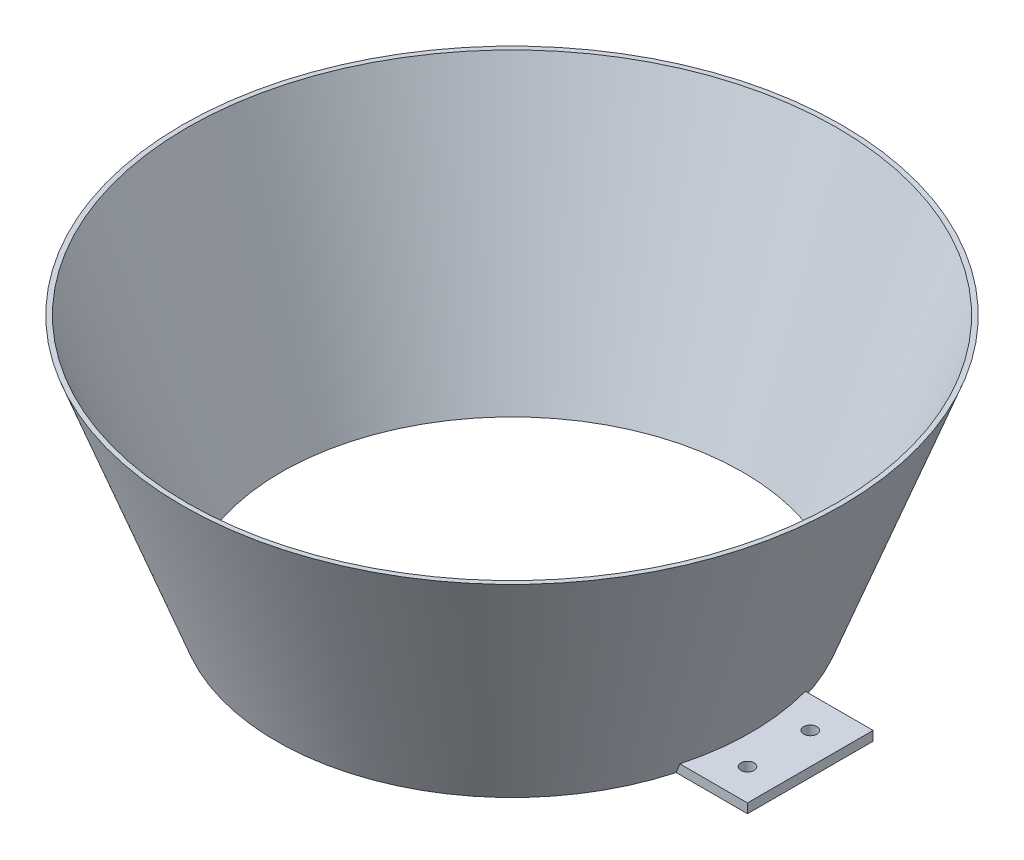
ISO-10303-21;
HEADER;
FILE_DESCRIPTION(('STEP AP214'),'2;1');
FILE_NAME('part.step','',(''),(''),'','','');
FILE_SCHEMA(('AUTOMOTIVE_DESIGN { 1 0 10303 214 1 1 1 1 }'));
ENDSEC;
DATA;
#1=APPLICATION_CONTEXT('core data for automotive mechanical design processes');
#2=APPLICATION_PROTOCOL_DEFINITION('international standard','automotive_design',2000,#1);
#3=PRODUCT_CONTEXT('',#1,'mechanical');
#4=PRODUCT('Part','Part','',(#3));
#5=PRODUCT_RELATED_PRODUCT_CATEGORY('part','',(#4));
#6=PRODUCT_DEFINITION_FORMATION('','',#4);
#7=PRODUCT_DEFINITION_CONTEXT('part definition',#1,'design');
#8=PRODUCT_DEFINITION('design','',#6,#7);
#9=PRODUCT_DEFINITION_SHAPE('','',#8);
#10=(LENGTH_UNIT() NAMED_UNIT(*) SI_UNIT(.MILLI.,.METRE.));
#11=(NAMED_UNIT(*) PLANE_ANGLE_UNIT() SI_UNIT($,.RADIAN.));
#12=(NAMED_UNIT(*) SI_UNIT($,.STERADIAN.) SOLID_ANGLE_UNIT());
#13=UNCERTAINTY_MEASURE_WITH_UNIT(LENGTH_MEASURE(1.E-05),#10,'distance_accuracy_value','');
#14=(GEOMETRIC_REPRESENTATION_CONTEXT(3) GLOBAL_UNCERTAINTY_ASSIGNED_CONTEXT((#13)) GLOBAL_UNIT_ASSIGNED_CONTEXT((#10,
#11,#12)) REPRESENTATION_CONTEXT('',''));
#15=CARTESIAN_POINT('',(0.,0.,0.));
#16=DIRECTION('',(0.,0.,1.));
#17=DIRECTION('',(1.,0.,0.));
#18=AXIS2_PLACEMENT_3D('',#15,#16,#17);
#19=CARTESIAN_POINT('',(0.,80.,0.));
#20=DIRECTION('',(0.,1.,0.));
#21=DIRECTION('',(0.,0.,1.));
#22=AXIS2_PLACEMENT_3D('',#19,#20,#21);
#23=CONICAL_SURFACE('',#22,103.5,0.358770670270572);
#24=CARTESIAN_POINT('',(0.,0.,0.));
#25=DIRECTION('',(0.,-1.,0.));
#26=DIRECTION('',(0.,0.,-1.));
#27=AXIS2_PLACEMENT_3D('',#24,#25,#26);
#28=CIRCLE('',#27,73.5);
#29=CARTESIAN_POINT('',(0.,0.,-73.5));
#30=VERTEX_POINT('',#29);
#31=EDGE_CURVE('E191',#30,#30,#28,.T.);
#32=ORIENTED_EDGE('',*,*,#31,.T.);
#33=EDGE_LOOP('',(#32));
#34=FACE_BOUND('',#33,.T.);
#35=CARTESIAN_POINT('',(0.,80.,0.));
#36=DIRECTION('',(0.,-1.,0.));
#37=DIRECTION('',(0.,0.,-1.));
#38=AXIS2_PLACEMENT_3D('',#35,#36,#37);
#39=CIRCLE('',#38,103.5);
#40=CARTESIAN_POINT('',(0.,80.,-103.5));
#41=VERTEX_POINT('',#40);
#42=EDGE_CURVE('E177',#41,#41,#39,.T.);
#43=ORIENTED_EDGE('',*,*,#42,.F.);
#44=EDGE_LOOP('',(#43));
#45=FACE_BOUND('',#44,.T.);
#46=ADVANCED_FACE('F45',(#34,#45),#23,.F.);
#47=CARTESIAN_POINT('',(73.5,0.,0.));
#48=DIRECTION('',(0.,-1.,0.));
#49=DIRECTION('',(0.,0.,-1.));
#50=AXIS2_PLACEMENT_3D('',#47,#48,#49);
#51=PLANE('',#50);
#52=CARTESIAN_POINT('',(-85.,0.,10.));
#53=DIRECTION('',(0.,-1.,0.));
#54=DIRECTION('',(0.,0.,1.));
#55=AXIS2_PLACEMENT_3D('',#52,#53,#54);
#56=CIRCLE('',#55,2.1);
#57=CARTESIAN_POINT('',(-85.,0.,12.1));
#58=VERTEX_POINT('',#57);
#59=EDGE_CURVE('E250',#58,#58,#56,.T.);
#60=ORIENTED_EDGE('',*,*,#59,.F.);
#61=EDGE_LOOP('',(#60));
#62=FACE_BOUND('',#61,.T.);
#63=CARTESIAN_POINT('',(-85.,0.,-10.));
#64=DIRECTION('',(0.,-1.,0.));
#65=DIRECTION('',(0.,0.,-1.));
#66=AXIS2_PLACEMENT_3D('',#63,#64,#65);
#67=CIRCLE('',#66,2.1);
#68=CARTESIAN_POINT('',(-85.,0.,-12.1));
#69=VERTEX_POINT('',#68);
#70=EDGE_CURVE('E254',#69,#69,#67,.T.);
#71=ORIENTED_EDGE('',*,*,#70,.F.);
#72=EDGE_LOOP('',(#71));
#73=FACE_BOUND('',#72,.T.);
#74=CARTESIAN_POINT('',(85.,0.,-10.));
#75=DIRECTION('',(0.,-1.,0.));
#76=DIRECTION('',(0.,0.,1.));
#77=AXIS2_PLACEMENT_3D('',#74,#75,#76);
#78=CIRCLE('',#77,2.1);
#79=CARTESIAN_POINT('',(85.,0.,-7.9));
#80=VERTEX_POINT('',#79);
#81=EDGE_CURVE('E258',#80,#80,#78,.T.);
#82=ORIENTED_EDGE('',*,*,#81,.F.);
#83=EDGE_LOOP('',(#82));
#84=FACE_BOUND('',#83,.T.);
#85=CARTESIAN_POINT('',(85.,0.,10.));
#86=DIRECTION('',(0.,-1.,0.));
#87=DIRECTION('',(0.,0.,-1.));
#88=AXIS2_PLACEMENT_3D('',#85,#86,#87);
#89=CIRCLE('',#88,2.1);
#90=CARTESIAN_POINT('',(85.,0.,7.9));
#91=VERTEX_POINT('',#90);
#92=EDGE_CURVE('E261',#91,#91,#89,.T.);
#93=ORIENTED_EDGE('',*,*,#92,.F.);
#94=EDGE_LOOP('',(#93));
#95=FACE_BOUND('',#94,.T.);
#96=CARTESIAN_POINT('',(0.,0.,0.));
#97=DIRECTION('',(0.,-1.,0.));
#98=DIRECTION('',(0.,0.,-1.));
#99=AXIS2_PLACEMENT_3D('',#96,#97,#98);
#100=CIRCLE('',#99,75.);
#101=CARTESIAN_POINT('',(72.2841614740048,0.,20.));
#102=VERTEX_POINT('',#101);
#103=CARTESIAN_POINT('',(-72.2841614740048,0.,20.));
#104=VERTEX_POINT('',#103);
#105=EDGE_CURVE('E188',#102,#104,#100,.T.);
#106=ORIENTED_EDGE('',*,*,#105,.T.);
#107=DIRECTION('',(-1.,0.,0.));
#108=VECTOR('',#107,1.);
#109=CARTESIAN_POINT('',(-95.,0.,20.));
#110=LINE('',#109,#108);
#111=CARTESIAN_POINT('',(-95.,0.,20.));
#112=VERTEX_POINT('',#111);
#113=EDGE_CURVE('E133',#104,#112,#110,.T.);
#114=ORIENTED_EDGE('',*,*,#113,.T.);
#115=DIRECTION('',(0.,0.,-1.));
#116=VECTOR('',#115,1.);
#117=CARTESIAN_POINT('',(-95.,0.,-20.));
#118=LINE('',#117,#116);
#119=CARTESIAN_POINT('',(-95.,0.,-20.));
#120=VERTEX_POINT('',#119);
#121=EDGE_CURVE('E120',#112,#120,#118,.T.);
#122=ORIENTED_EDGE('',*,*,#121,.T.);
#123=DIRECTION('',(1.,0.,0.));
#124=VECTOR('',#123,1.);
#125=CARTESIAN_POINT('',(-72.2841614740048,0.,-20.));
#126=LINE('',#125,#124);
#127=CARTESIAN_POINT('',(-72.2841614740048,0.,-20.));
#128=VERTEX_POINT('',#127);
#129=EDGE_CURVE('E66',#120,#128,#126,.T.);
#130=ORIENTED_EDGE('',*,*,#129,.T.);
#131=CARTESIAN_POINT('',(72.2841614740048,0.,-20.));
#132=VERTEX_POINT('',#131);
#133=EDGE_CURVE('E187',#128,#132,#100,.T.);
#134=ORIENTED_EDGE('',*,*,#133,.T.);
#135=DIRECTION('',(1.,0.,0.));
#136=VECTOR('',#135,1.);
#137=CARTESIAN_POINT('',(72.2841614740048,0.,-20.));
#138=LINE('',#137,#136);
#139=CARTESIAN_POINT('',(95.,0.,-20.));
#140=VERTEX_POINT('',#139);
#141=EDGE_CURVE('E148',#132,#140,#138,.T.);
#142=ORIENTED_EDGE('',*,*,#141,.T.);
#143=DIRECTION('',(0.,0.,1.));
#144=VECTOR('',#143,1.);
#145=CARTESIAN_POINT('',(95.,0.,-20.));
#146=LINE('',#145,#144);
#147=CARTESIAN_POINT('',(95.,0.,20.));
#148=VERTEX_POINT('',#147);
#149=EDGE_CURVE('E169',#140,#148,#146,.T.);
#150=ORIENTED_EDGE('',*,*,#149,.T.);
#151=DIRECTION('',(-1.,0.,0.));
#152=VECTOR('',#151,1.);
#153=CARTESIAN_POINT('',(95.,0.,20.));
#154=LINE('',#153,#152);
#155=EDGE_CURVE('E72',#148,#102,#154,.T.);
#156=ORIENTED_EDGE('',*,*,#155,.T.);
#157=EDGE_LOOP('',(#106,#114,#122,#130,#134,#142,#150,#156));
#158=FACE_BOUND('',#157,.T.);
#159=ORIENTED_EDGE('',*,*,#31,.F.);
#160=EDGE_LOOP('',(#159));
#161=FACE_BOUND('',#160,.T.);
#162=ADVANCED_FACE('F131',(#62,#73,#84,#95,#158,#161),#51,.T.);
#163=CARTESIAN_POINT('',(0.,0.,0.));
#164=DIRECTION('',(0.,1.,0.));
#165=DIRECTION('',(0.,0.,1.));
#166=AXIS2_PLACEMENT_3D('',#163,#164,#165);
#167=CONICAL_SURFACE('',#166,75.,0.358770670270572);
#168=CARTESIAN_POINT('',(-82.3228494113202,25.9132818516211,-20.));
#169=CARTESIAN_POINT('',(-80.7508997462355,21.8400242950529,-20.));
#170=CARTESIAN_POINT('',(-79.176843554468,17.7675783099206,-20.));
#171=CARTESIAN_POINT('',(-76.0235102987201,9.6247199509703,-20.));
#172=CARTESIAN_POINT('',(-74.444233247653,5.55430757215105,-20.));
#173=CARTESIAN_POINT('',(-71.2794413744819,-2.58409663780907,-20.));
#174=CARTESIAN_POINT('',(-69.6939265471767,-6.65208846692836,-20.));
#175=CARTESIAN_POINT('',(-67.3099242302914,-12.7518423217161,-20.));
#176=CARTESIAN_POINT('',(-66.5143007800586,-14.7847238328228,-20.));
#177=CARTESIAN_POINT('',(-64.9209219338623,-18.8496516772735,-20.));
#178=CARTESIAN_POINT('',(-64.1231665373971,-20.8816980104208,-20.));
#179=CARTESIAN_POINT('',(-63.3242340682398,-22.9132818516211,-20.));
#180=B_SPLINE_CURVE_WITH_KNOTS('',3,(#168,#169,#170,#171,#172,#173,#174,#175,#176,#177,#178,
#179),.UNSPECIFIED.,.F.,.F.,(4,2,2,2,2,4),(0.,13.0981719589095,26.1963115452724,
39.2944620556021,45.8435536918133,52.3926468690878),.UNSPECIFIED.);
#181=CARTESIAN_POINT('',(-73.4507700776513,3.,-20.));
#182=VERTEX_POINT('',#181);
#183=EDGE_CURVE('E11',#182,#128,#180,.T.);
#184=ORIENTED_EDGE('',*,*,#183,.F.);
#185=CARTESIAN_POINT('',(0.,3.,0.));
#186=DIRECTION('',(0.,-1.,0.));
#187=DIRECTION('',(0.,0.,-1.));
#188=AXIS2_PLACEMENT_3D('',#185,#186,#187);
#189=CIRCLE('',#188,76.125);
#190=CARTESIAN_POINT('',(-73.4507700776513,3.,20.));
#191=VERTEX_POINT('',#190);
#192=EDGE_CURVE('E280',#182,#191,#189,.F.);
#193=ORIENTED_EDGE('',*,*,#192,.T.);
#194=CARTESIAN_POINT('',(-63.3242340682398,-22.9132818516211,20.));
#195=CARTESIAN_POINT('',(-64.1231665373971,-20.8816980104208,20.));
#196=CARTESIAN_POINT('',(-64.9209219338623,-18.8496516772735,20.));
#197=CARTESIAN_POINT('',(-66.5143007800586,-14.7847238328228,20.));
#198=CARTESIAN_POINT('',(-67.3099242302914,-12.7518423217161,20.));
#199=CARTESIAN_POINT('',(-69.6939265471767,-6.65208846692836,20.));
#200=CARTESIAN_POINT('',(-71.2794413744819,-2.58409663780908,20.));
#201=CARTESIAN_POINT('',(-74.444233247653,5.55430757215104,20.));
#202=CARTESIAN_POINT('',(-76.0235102987201,9.62471995097029,20.));
#203=CARTESIAN_POINT('',(-79.176843554468,17.7675783099206,20.));
#204=CARTESIAN_POINT('',(-80.7508997462355,21.8400242950529,20.));
#205=CARTESIAN_POINT('',(-82.3228494113202,25.9132818516211,20.));
#206=B_SPLINE_CURVE_WITH_KNOTS('',3,(#194,#195,#196,#197,#198,#199,#200,#201,#202,#203,#204,
#205),.UNSPECIFIED.,.F.,.F.,(4,2,2,2,2,4),(0.,6.54909317727453,13.0981848134857,
26.1963353238154,39.2944749101783,52.3926468690878),.UNSPECIFIED.);
#207=EDGE_CURVE('E59',#104,#191,#206,.T.);
#208=ORIENTED_EDGE('',*,*,#207,.F.);
#209=ORIENTED_EDGE('',*,*,#105,.F.);
#210=CARTESIAN_POINT('',(82.3228494113202,25.9132818516211,20.));
#211=CARTESIAN_POINT('',(80.7508997462355,21.8400242950529,20.));
#212=CARTESIAN_POINT('',(79.176843554468,17.7675783099206,20.));
#213=CARTESIAN_POINT('',(76.0235102987201,9.6247199509703,20.));
#214=CARTESIAN_POINT('',(74.444233247653,5.55430757215105,20.));
#215=CARTESIAN_POINT('',(71.2794413744819,-2.58409663780907,20.));
#216=CARTESIAN_POINT('',(69.6939265471767,-6.65208846692836,20.));
#217=CARTESIAN_POINT('',(67.3099242302914,-12.7518423217161,20.));
#218=CARTESIAN_POINT('',(66.5143007800586,-14.7847238328228,20.));
#219=CARTESIAN_POINT('',(64.9209219338623,-18.8496516772735,20.));
#220=CARTESIAN_POINT('',(64.1231665373971,-20.8816980104208,20.));
#221=CARTESIAN_POINT('',(63.3242340682398,-22.9132818516211,20.));
#222=B_SPLINE_CURVE_WITH_KNOTS('',3,(#210,#211,#212,#213,#214,#215,#216,#217,#218,#219,#220,
#221),.UNSPECIFIED.,.F.,.F.,(4,2,2,2,2,4),(0.,13.0981719589095,26.1963115452724,
39.2944620556021,45.8435536918133,52.3926468690878),.UNSPECIFIED.);
#223=CARTESIAN_POINT('',(73.4507700776513,3.,20.));
#224=VERTEX_POINT('',#223);
#225=EDGE_CURVE('E206',#224,#102,#222,.T.);
#226=ORIENTED_EDGE('',*,*,#225,.F.);
#227=CARTESIAN_POINT('',(0.,3.,0.));
#228=DIRECTION('',(0.,1.,0.));
#229=DIRECTION('',(0.,0.,1.));
#230=AXIS2_PLACEMENT_3D('',#227,#228,#229);
#231=CIRCLE('',#230,76.125);
#232=CARTESIAN_POINT('',(73.4507700776513,3.,-20.));
#233=VERTEX_POINT('',#232);
#234=EDGE_CURVE('E195',#233,#224,#231,.F.);
#235=ORIENTED_EDGE('',*,*,#234,.F.);
#236=CARTESIAN_POINT('',(63.3242340682398,-22.9132818516211,-20.));
#237=CARTESIAN_POINT('',(64.1231665373971,-20.8816980104208,-20.));
#238=CARTESIAN_POINT('',(64.9209219338623,-18.8496516772735,-20.));
#239=CARTESIAN_POINT('',(66.5143007800586,-14.7847238328228,-20.));
#240=CARTESIAN_POINT('',(67.3099242302914,-12.7518423217161,-20.));
#241=CARTESIAN_POINT('',(69.6939265471767,-6.65208846692836,-20.));
#242=CARTESIAN_POINT('',(71.2794413744819,-2.58409663780908,-20.));
#243=CARTESIAN_POINT('',(74.444233247653,5.55430757215104,-20.));
#244=CARTESIAN_POINT('',(76.0235102987201,9.62471995097029,-20.));
#245=CARTESIAN_POINT('',(79.176843554468,17.7675783099206,-20.));
#246=CARTESIAN_POINT('',(80.7508997462355,21.8400242950529,-20.));
#247=CARTESIAN_POINT('',(82.3228494113202,25.9132818516211,-20.));
#248=B_SPLINE_CURVE_WITH_KNOTS('',3,(#236,#237,#238,#239,#240,#241,#242,#243,#244,#245,#246,
#247),.UNSPECIFIED.,.F.,.F.,(4,2,2,2,2,4),(0.,6.54909317727453,13.0981848134857,
26.1963353238154,39.2944749101783,52.3926468690878),.UNSPECIFIED.);
#249=EDGE_CURVE('E198',#132,#233,#248,.T.);
#250=ORIENTED_EDGE('',*,*,#249,.F.);
#251=ORIENTED_EDGE('',*,*,#133,.F.);
#252=EDGE_LOOP('',(#184,#193,#208,#209,#226,#235,#250,#251));
#253=FACE_BOUND('',#252,.T.);
#254=CARTESIAN_POINT('',(0.,80.,0.));
#255=DIRECTION('',(0.,-1.,0.));
#256=DIRECTION('',(0.,0.,-1.));
#257=AXIS2_PLACEMENT_3D('',#254,#255,#256);
#258=CIRCLE('',#257,105.);
#259=CARTESIAN_POINT('',(0.,80.,-105.));
#260=VERTEX_POINT('',#259);
#261=EDGE_CURVE('E183',#260,#260,#258,.T.);
#262=ORIENTED_EDGE('',*,*,#261,.T.);
#263=EDGE_LOOP('',(#262));
#264=FACE_BOUND('',#263,.T.);
#265=ADVANCED_FACE('F213',(#253,#264),#167,.T.);
#266=CARTESIAN_POINT('',(105.,80.,0.));
#267=DIRECTION('',(0.,1.,0.));
#268=DIRECTION('',(0.,0.,1.));
#269=AXIS2_PLACEMENT_3D('',#266,#267,#268);
#270=PLANE('',#269);
#271=ORIENTED_EDGE('',*,*,#42,.T.);
#272=EDGE_LOOP('',(#271));
#273=FACE_BOUND('',#272,.T.);
#274=ORIENTED_EDGE('',*,*,#261,.F.);
#275=EDGE_LOOP('',(#274));
#276=FACE_BOUND('',#275,.T.);
#277=ADVANCED_FACE('F223',(#273,#276),#270,.T.);
#278=CARTESIAN_POINT('',(95.,3.,20.));
#279=DIRECTION('',(0.,0.,1.));
#280=DIRECTION('',(1.,0.,0.));
#281=AXIS2_PLACEMENT_3D('',#278,#279,#280);
#282=PLANE('',#281);
#283=DIRECTION('',(-1.,0.,0.));
#284=VECTOR('',#283,1.);
#285=CARTESIAN_POINT('',(95.,3.,20.));
#286=LINE('',#285,#284);
#287=CARTESIAN_POINT('',(95.,3.,20.));
#288=VERTEX_POINT('',#287);
#289=EDGE_CURVE('E161',#288,#224,#286,.T.);
#290=ORIENTED_EDGE('',*,*,#289,.T.);
#291=ORIENTED_EDGE('',*,*,#225,.T.);
#292=ORIENTED_EDGE('',*,*,#155,.F.);
#293=DIRECTION('',(0.,-1.,0.));
#294=VECTOR('',#293,1.);
#295=CARTESIAN_POINT('',(95.,3.,20.));
#296=LINE('',#295,#294);
#297=EDGE_CURVE('E174',#288,#148,#296,.T.);
#298=ORIENTED_EDGE('',*,*,#297,.F.);
#299=EDGE_LOOP('',(#290,#291,#292,#298));
#300=FACE_BOUND('',#299,.T.);
#301=ADVANCED_FACE('F225',(#300),#282,.T.);
#302=CARTESIAN_POINT('',(95.,3.,-20.));
#303=DIRECTION('',(1.,0.,0.));
#304=DIRECTION('',(0.,0.,-1.));
#305=AXIS2_PLACEMENT_3D('',#302,#303,#304);
#306=PLANE('',#305);
#307=ORIENTED_EDGE('',*,*,#149,.F.);
#308=DIRECTION('',(0.,-1.,0.));
#309=VECTOR('',#308,1.);
#310=CARTESIAN_POINT('',(95.,3.,-20.));
#311=LINE('',#310,#309);
#312=CARTESIAN_POINT('',(95.,3.,-20.));
#313=VERTEX_POINT('',#312);
#314=EDGE_CURVE('E165',#313,#140,#311,.T.);
#315=ORIENTED_EDGE('',*,*,#314,.F.);
#316=DIRECTION('',(0.,0.,1.));
#317=VECTOR('',#316,1.);
#318=CARTESIAN_POINT('',(95.,3.,-20.));
#319=LINE('',#318,#317);
#320=EDGE_CURVE('E157',#313,#288,#319,.T.);
#321=ORIENTED_EDGE('',*,*,#320,.T.);
#322=ORIENTED_EDGE('',*,*,#297,.T.);
#323=EDGE_LOOP('',(#307,#315,#321,#322));
#324=FACE_BOUND('',#323,.T.);
#325=ADVANCED_FACE('F221',(#324),#306,.T.);
#326=CARTESIAN_POINT('',(72.2841614740048,3.,-20.));
#327=DIRECTION('',(0.,0.,-1.));
#328=DIRECTION('',(-1.,0.,0.));
#329=AXIS2_PLACEMENT_3D('',#326,#327,#328);
#330=PLANE('',#329);
#331=ORIENTED_EDGE('',*,*,#141,.F.);
#332=ORIENTED_EDGE('',*,*,#249,.T.);
#333=DIRECTION('',(1.,0.,0.));
#334=VECTOR('',#333,1.);
#335=CARTESIAN_POINT('',(72.2841614740048,3.,-20.));
#336=LINE('',#335,#334);
#337=EDGE_CURVE('E154',#233,#313,#336,.T.);
#338=ORIENTED_EDGE('',*,*,#337,.T.);
#339=ORIENTED_EDGE('',*,*,#314,.T.);
#340=EDGE_LOOP('',(#331,#332,#338,#339));
#341=FACE_BOUND('',#340,.T.);
#342=ADVANCED_FACE('F216',(#341),#330,.T.);
#343=CARTESIAN_POINT('',(0.,3.,0.));
#344=DIRECTION('',(0.,1.,0.));
#345=DIRECTION('',(0.,0.,1.));
#346=AXIS2_PLACEMENT_3D('',#343,#344,#345);
#347=PLANE('',#346);
#348=CARTESIAN_POINT('',(85.,3.,-10.));
#349=DIRECTION('',(0.,-1.,0.));
#350=DIRECTION('',(0.,0.,1.));
#351=AXIS2_PLACEMENT_3D('',#348,#349,#350);
#352=CIRCLE('',#351,2.1);
#353=CARTESIAN_POINT('',(85.,3.,-7.9));
#354=VERTEX_POINT('',#353);
#355=EDGE_CURVE('E269',#354,#354,#352,.T.);
#356=ORIENTED_EDGE('',*,*,#355,.T.);
#357=EDGE_LOOP('',(#356));
#358=FACE_BOUND('',#357,.T.);
#359=CARTESIAN_POINT('',(85.,3.,10.));
#360=DIRECTION('',(0.,-1.,0.));
#361=DIRECTION('',(0.,0.,-1.));
#362=AXIS2_PLACEMENT_3D('',#359,#360,#361);
#363=CIRCLE('',#362,2.1);
#364=CARTESIAN_POINT('',(85.,3.,7.9));
#365=VERTEX_POINT('',#364);
#366=EDGE_CURVE('E129',#365,#365,#363,.T.);
#367=ORIENTED_EDGE('',*,*,#366,.T.);
#368=EDGE_LOOP('',(#367));
#369=FACE_BOUND('',#368,.T.);
#370=ORIENTED_EDGE('',*,*,#337,.F.);
#371=ORIENTED_EDGE('',*,*,#234,.T.);
#372=ORIENTED_EDGE('',*,*,#289,.F.);
#373=ORIENTED_EDGE('',*,*,#320,.F.);
#374=EDGE_LOOP('',(#370,#371,#372,#373));
#375=FACE_BOUND('',#374,.T.);
#376=ADVANCED_FACE('F220',(#358,#369,#375),#347,.T.);
#377=CARTESIAN_POINT('',(-72.2841614740048,3.,-20.));
#378=DIRECTION('',(0.,0.,-1.));
#379=DIRECTION('',(-1.,0.,0.));
#380=AXIS2_PLACEMENT_3D('',#377,#378,#379);
#381=PLANE('',#380);
#382=DIRECTION('',(1.,0.,0.));
#383=VECTOR('',#382,1.);
#384=CARTESIAN_POINT('',(-72.2841614740048,3.,-20.));
#385=LINE('',#384,#383);
#386=CARTESIAN_POINT('',(-95.,3.,-20.));
#387=VERTEX_POINT('',#386);
#388=EDGE_CURVE('E149',#387,#182,#385,.T.);
#389=ORIENTED_EDGE('',*,*,#388,.T.);
#390=ORIENTED_EDGE('',*,*,#183,.T.);
#391=ORIENTED_EDGE('',*,*,#129,.F.);
#392=DIRECTION('',(0.,-1.,0.));
#393=VECTOR('',#392,1.);
#394=CARTESIAN_POINT('',(-95.,3.,-20.));
#395=LINE('',#394,#393);
#396=EDGE_CURVE('E117',#387,#120,#395,.T.);
#397=ORIENTED_EDGE('',*,*,#396,.F.);
#398=EDGE_LOOP('',(#389,#390,#391,#397));
#399=FACE_BOUND('',#398,.T.);
#400=ADVANCED_FACE('F136',(#399),#381,.T.);
#401=CARTESIAN_POINT('',(-95.,3.,-20.));
#402=DIRECTION('',(-1.,0.,0.));
#403=DIRECTION('',(0.,0.,1.));
#404=AXIS2_PLACEMENT_3D('',#401,#402,#403);
#405=PLANE('',#404);
#406=ORIENTED_EDGE('',*,*,#121,.F.);
#407=DIRECTION('',(0.,-1.,0.));
#408=VECTOR('',#407,1.);
#409=CARTESIAN_POINT('',(-95.,3.,20.));
#410=LINE('',#409,#408);
#411=CARTESIAN_POINT('',(-95.,3.,20.));
#412=VERTEX_POINT('',#411);
#413=EDGE_CURVE('E128',#412,#112,#410,.T.);
#414=ORIENTED_EDGE('',*,*,#413,.F.);
#415=DIRECTION('',(0.,0.,-1.));
#416=VECTOR('',#415,1.);
#417=CARTESIAN_POINT('',(-95.,3.,-20.));
#418=LINE('',#417,#416);
#419=EDGE_CURVE('E123',#412,#387,#418,.T.);
#420=ORIENTED_EDGE('',*,*,#419,.T.);
#421=ORIENTED_EDGE('',*,*,#396,.T.);
#422=EDGE_LOOP('',(#406,#414,#420,#421));
#423=FACE_BOUND('',#422,.T.);
#424=ADVANCED_FACE('F118',(#423),#405,.T.);
#425=CARTESIAN_POINT('',(-95.,3.,20.));
#426=DIRECTION('',(0.,0.,1.));
#427=DIRECTION('',(1.,0.,0.));
#428=AXIS2_PLACEMENT_3D('',#425,#426,#427);
#429=PLANE('',#428);
#430=ORIENTED_EDGE('',*,*,#113,.F.);
#431=ORIENTED_EDGE('',*,*,#207,.T.);
#432=DIRECTION('',(-1.,0.,0.));
#433=VECTOR('',#432,1.);
#434=CARTESIAN_POINT('',(-95.,3.,20.));
#435=LINE('',#434,#433);
#436=EDGE_CURVE('E140',#191,#412,#435,.T.);
#437=ORIENTED_EDGE('',*,*,#436,.T.);
#438=ORIENTED_EDGE('',*,*,#413,.T.);
#439=EDGE_LOOP('',(#430,#431,#437,#438));
#440=FACE_BOUND('',#439,.T.);
#441=ADVANCED_FACE('F274',(#440),#429,.T.);
#442=CARTESIAN_POINT('',(0.,3.,0.));
#443=DIRECTION('',(0.,-1.,0.));
#444=DIRECTION('',(0.,0.,-1.));
#445=AXIS2_PLACEMENT_3D('',#442,#443,#444);
#446=PLANE('',#445);
#447=CARTESIAN_POINT('',(-85.,3.,10.));
#448=DIRECTION('',(0.,-1.,0.));
#449=DIRECTION('',(0.,0.,1.));
#450=AXIS2_PLACEMENT_3D('',#447,#448,#449);
#451=CIRCLE('',#450,2.1);
#452=CARTESIAN_POINT('',(-85.,3.,12.1));
#453=VERTEX_POINT('',#452);
#454=EDGE_CURVE('E406',#453,#453,#451,.T.);
#455=ORIENTED_EDGE('',*,*,#454,.T.);
#456=EDGE_LOOP('',(#455));
#457=FACE_BOUND('',#456,.T.);
#458=CARTESIAN_POINT('',(-85.,3.,-10.));
#459=DIRECTION('',(0.,-1.,0.));
#460=DIRECTION('',(0.,0.,-1.));
#461=AXIS2_PLACEMENT_3D('',#458,#459,#460);
#462=CIRCLE('',#461,2.1);
#463=CARTESIAN_POINT('',(-85.,3.,-12.1));
#464=VERTEX_POINT('',#463);
#465=EDGE_CURVE('E399',#464,#464,#462,.T.);
#466=ORIENTED_EDGE('',*,*,#465,.T.);
#467=EDGE_LOOP('',(#466));
#468=FACE_BOUND('',#467,.T.);
#469=ORIENTED_EDGE('',*,*,#192,.F.);
#470=ORIENTED_EDGE('',*,*,#388,.F.);
#471=ORIENTED_EDGE('',*,*,#419,.F.);
#472=ORIENTED_EDGE('',*,*,#436,.F.);
#473=EDGE_LOOP('',(#469,#470,#471,#472));
#474=FACE_BOUND('',#473,.T.);
#475=ADVANCED_FACE('F278',(#457,#468,#474),#446,.F.);
#476=CARTESIAN_POINT('',(-85.,3.,-10.));
#477=DIRECTION('',(0.,-1.,0.));
#478=DIRECTION('',(0.,0.,-1.));
#479=AXIS2_PLACEMENT_3D('',#476,#477,#478);
#480=CYLINDRICAL_SURFACE('',#479,2.1);
#481=ORIENTED_EDGE('',*,*,#465,.F.);
#482=EDGE_LOOP('',(#481));
#483=FACE_BOUND('',#482,.T.);
#484=ORIENTED_EDGE('',*,*,#70,.T.);
#485=EDGE_LOOP('',(#484));
#486=FACE_BOUND('',#485,.T.);
#487=ADVANCED_FACE('F305',(#483,#486),#480,.F.);
#488=CARTESIAN_POINT('',(-85.,3.,10.));
#489=DIRECTION('',(0.,-1.,0.));
#490=DIRECTION('',(0.,0.,-1.));
#491=AXIS2_PLACEMENT_3D('',#488,#489,#490);
#492=CYLINDRICAL_SURFACE('',#491,2.1);
#493=ORIENTED_EDGE('',*,*,#454,.F.);
#494=EDGE_LOOP('',(#493));
#495=FACE_BOUND('',#494,.T.);
#496=ORIENTED_EDGE('',*,*,#59,.T.);
#497=EDGE_LOOP('',(#496));
#498=FACE_BOUND('',#497,.T.);
#499=ADVANCED_FACE('F365',(#495,#498),#492,.F.);
#500=CARTESIAN_POINT('',(85.,3.,10.));
#501=DIRECTION('',(0.,-1.,0.));
#502=DIRECTION('',(0.,0.,-1.));
#503=AXIS2_PLACEMENT_3D('',#500,#501,#502);
#504=CYLINDRICAL_SURFACE('',#503,2.1);
#505=ORIENTED_EDGE('',*,*,#366,.F.);
#506=EDGE_LOOP('',(#505));
#507=FACE_BOUND('',#506,.T.);
#508=ORIENTED_EDGE('',*,*,#92,.T.);
#509=EDGE_LOOP('',(#508));
#510=FACE_BOUND('',#509,.T.);
#511=ADVANCED_FACE('F297',(#507,#510),#504,.F.);
#512=CARTESIAN_POINT('',(85.,3.,-10.));
#513=DIRECTION('',(0.,-1.,0.));
#514=DIRECTION('',(0.,0.,-1.));
#515=AXIS2_PLACEMENT_3D('',#512,#513,#514);
#516=CYLINDRICAL_SURFACE('',#515,2.1);
#517=ORIENTED_EDGE('',*,*,#355,.F.);
#518=EDGE_LOOP('',(#517));
#519=FACE_BOUND('',#518,.T.);
#520=ORIENTED_EDGE('',*,*,#81,.T.);
#521=EDGE_LOOP('',(#520));
#522=FACE_BOUND('',#521,.T.);
#523=ADVANCED_FACE('F383',(#519,#522),#516,.F.);
#524=CLOSED_SHELL('',(#46,#162,#265,#277,#301,#325,#342,#376,#400,#424,#441,#475,#487,#499,#511,#523));
#525=MANIFOLD_SOLID_BREP('B2',#524);
#526=ADVANCED_BREP_SHAPE_REPRESENTATION('',(#18,#525),#14);
#527=SHAPE_DEFINITION_REPRESENTATION(#9,#526);
ENDSEC;
END-ISO-10303-21;
